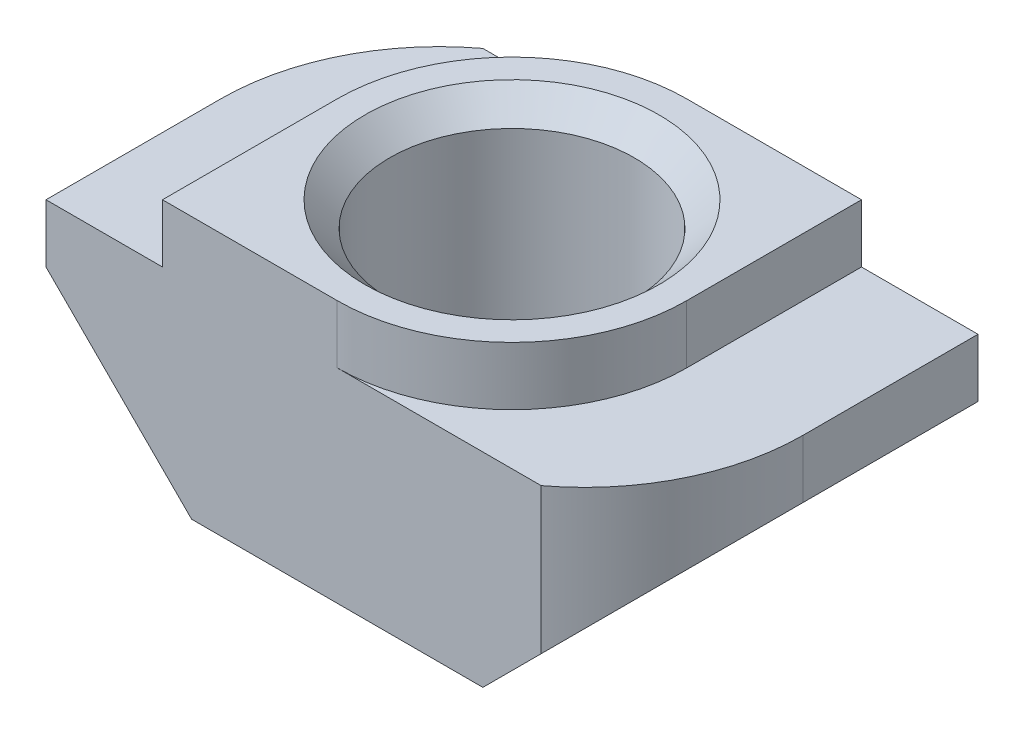
ISO-10303-21;
HEADER;
FILE_DESCRIPTION(('STEP AP214'),'2;1');
FILE_NAME('part.step','',(''),(''),'','','');
FILE_SCHEMA(('AUTOMOTIVE_DESIGN { 1 0 10303 214 1 1 1 1 }'));
ENDSEC;
DATA;
#1=APPLICATION_CONTEXT('core data for automotive mechanical design processes');
#2=APPLICATION_PROTOCOL_DEFINITION('international standard','automotive_design',2000,#1);
#3=PRODUCT_CONTEXT('',#1,'mechanical');
#4=PRODUCT('Part','Part','',(#3));
#5=PRODUCT_RELATED_PRODUCT_CATEGORY('part','',(#4));
#6=PRODUCT_DEFINITION_FORMATION('','',#4);
#7=PRODUCT_DEFINITION_CONTEXT('part definition',#1,'design');
#8=PRODUCT_DEFINITION('design','',#6,#7);
#9=PRODUCT_DEFINITION_SHAPE('','',#8);
#10=(LENGTH_UNIT() NAMED_UNIT(*) SI_UNIT(.MILLI.,.METRE.));
#11=(NAMED_UNIT(*) PLANE_ANGLE_UNIT() SI_UNIT($,.RADIAN.));
#12=(NAMED_UNIT(*) SI_UNIT($,.STERADIAN.) SOLID_ANGLE_UNIT());
#13=UNCERTAINTY_MEASURE_WITH_UNIT(LENGTH_MEASURE(1.E-05),#10,'distance_accuracy_value','');
#14=(GEOMETRIC_REPRESENTATION_CONTEXT(3) GLOBAL_UNCERTAINTY_ASSIGNED_CONTEXT((#13)) GLOBAL_UNIT_ASSIGNED_CONTEXT((#10,
#11,#12)) REPRESENTATION_CONTEXT('',''));
#15=CARTESIAN_POINT('',(0.,0.,0.));
#16=DIRECTION('',(0.,0.,1.));
#17=DIRECTION('',(1.,0.,0.));
#18=AXIS2_PLACEMENT_3D('',#15,#16,#17);
#19=CARTESIAN_POINT('',(-3.,4.5,6.));
#20=DIRECTION('',(0.,-1.,0.));
#21=DIRECTION('',(0.,0.,-1.));
#22=AXIS2_PLACEMENT_3D('',#19,#20,#21);
#23=PLANE('',#22);
#24=CARTESIAN_POINT('',(0.,4.5,3.));
#25=DIRECTION('',(0.,1.,0.));
#26=DIRECTION('',(0.,0.,1.));
#27=AXIS2_PLACEMENT_3D('',#24,#25,#26);
#28=CIRCLE('',#27,2.525);
#29=CARTESIAN_POINT('',(0.,4.5,5.525));
#30=VERTEX_POINT('',#29);
#31=EDGE_CURVE('E262',#30,#30,#28,.T.);
#32=ORIENTED_EDGE('',*,*,#31,.F.);
#33=EDGE_LOOP('',(#32));
#34=FACE_BOUND('',#33,.T.);
#35=DIRECTION('',(-1.,0.,0.));
#36=VECTOR('',#35,1.);
#37=CARTESIAN_POINT('',(-3.,4.5,6.));
#38=LINE('',#37,#36);
#39=CARTESIAN_POINT('',(0.,4.5,6.));
#40=VERTEX_POINT('',#39);
#41=CARTESIAN_POINT('',(-3.,4.5,6.));
#42=VERTEX_POINT('',#41);
#43=EDGE_CURVE('E230',#40,#42,#38,.T.);
#44=ORIENTED_EDGE('',*,*,#43,.F.);
#45=CARTESIAN_POINT('',(0.,4.5,3.));
#46=DIRECTION('',(0.,-1.,0.));
#47=DIRECTION('',(0.,0.,-1.));
#48=AXIS2_PLACEMENT_3D('',#45,#46,#47);
#49=CIRCLE('',#48,3.);
#50=CARTESIAN_POINT('',(3.,4.5,3.));
#51=VERTEX_POINT('',#50);
#52=EDGE_CURVE('E248',#51,#40,#49,.T.);
#53=ORIENTED_EDGE('',*,*,#52,.F.);
#54=DIRECTION('',(0.,0.,-1.));
#55=VECTOR('',#54,1.);
#56=CARTESIAN_POINT('',(3.,4.5,6.));
#57=LINE('',#56,#55);
#58=CARTESIAN_POINT('',(3.,4.5,0.));
#59=VERTEX_POINT('',#58);
#60=EDGE_CURVE('E173',#51,#59,#57,.T.);
#61=ORIENTED_EDGE('',*,*,#60,.T.);
#62=DIRECTION('',(-1.,0.,0.));
#63=VECTOR('',#62,1.);
#64=CARTESIAN_POINT('',(-3.,4.5,0.));
#65=LINE('',#64,#63);
#66=CARTESIAN_POINT('',(0.,4.5,0.));
#67=VERTEX_POINT('',#66);
#68=EDGE_CURVE('E208',#59,#67,#65,.T.);
#69=ORIENTED_EDGE('',*,*,#68,.T.);
#70=CARTESIAN_POINT('',(0.,4.5,3.00000000000001));
#71=DIRECTION('',(0.,-1.,0.));
#72=DIRECTION('',(0.,0.,-1.));
#73=AXIS2_PLACEMENT_3D('',#70,#71,#72);
#74=CIRCLE('',#73,3.00000000000001);
#75=CARTESIAN_POINT('',(-3.,4.5,3.));
#76=VERTEX_POINT('',#75);
#77=EDGE_CURVE('E238',#76,#67,#74,.T.);
#78=ORIENTED_EDGE('',*,*,#77,.F.);
#79=DIRECTION('',(0.,0.,-1.));
#80=VECTOR('',#79,1.);
#81=CARTESIAN_POINT('',(-3.,4.5,6.));
#82=LINE('',#81,#80);
#83=EDGE_CURVE('E177',#42,#76,#82,.T.);
#84=ORIENTED_EDGE('',*,*,#83,.F.);
#85=EDGE_LOOP('',(#44,#53,#61,#69,#78,#84));
#86=FACE_BOUND('',#85,.T.);
#87=ADVANCED_FACE('F51',(#34,#86),#23,.F.);
#88=CARTESIAN_POINT('',(5.,3.5,6.));
#89=DIRECTION('',(-1.,0.,0.));
#90=DIRECTION('',(0.,0.,1.));
#91=AXIS2_PLACEMENT_3D('',#88,#89,#90);
#92=PLANE('',#91);
#93=DIRECTION('',(0.,0.,-1.));
#94=VECTOR('',#93,1.);
#95=CARTESIAN_POINT('',(5.,3.5,6.));
#96=LINE('',#95,#94);
#97=CARTESIAN_POINT('',(5.,3.5,3.));
#98=VERTEX_POINT('',#97);
#99=CARTESIAN_POINT('',(5.,3.5,0.));
#100=VERTEX_POINT('',#99);
#101=EDGE_CURVE('E162',#98,#100,#96,.T.);
#102=ORIENTED_EDGE('',*,*,#101,.F.);
#103=DIRECTION('',(0.,1.,0.));
#104=VECTOR('',#103,1.);
#105=CARTESIAN_POINT('',(5.,0.,3.));
#106=LINE('',#105,#104);
#107=CARTESIAN_POINT('',(5.,2.5,3.));
#108=VERTEX_POINT('',#107);
#109=EDGE_CURVE('E149',#108,#98,#106,.T.);
#110=ORIENTED_EDGE('',*,*,#109,.F.);
#111=DIRECTION('',(0.,0.,-1.));
#112=VECTOR('',#111,1.);
#113=CARTESIAN_POINT('',(5.,2.5,6.));
#114=LINE('',#113,#112);
#115=CARTESIAN_POINT('',(5.,2.5,0.));
#116=VERTEX_POINT('',#115);
#117=EDGE_CURVE('E195',#108,#116,#114,.T.);
#118=ORIENTED_EDGE('',*,*,#117,.T.);
#119=DIRECTION('',(0.,1.,0.));
#120=VECTOR('',#119,1.);
#121=CARTESIAN_POINT('',(5.,3.5,0.));
#122=LINE('',#121,#120);
#123=EDGE_CURVE('E170',#116,#100,#122,.T.);
#124=ORIENTED_EDGE('',*,*,#123,.T.);
#125=EDGE_LOOP('',(#102,#110,#118,#124));
#126=FACE_BOUND('',#125,.T.);
#127=ADVANCED_FACE('F53',(#126),#92,.F.);
#128=CARTESIAN_POINT('',(3.,3.5,6.));
#129=DIRECTION('',(0.,-1.,0.));
#130=DIRECTION('',(0.,0.,-1.));
#131=AXIS2_PLACEMENT_3D('',#128,#129,#130);
#132=PLANE('',#131);
#133=DIRECTION('',(-1.,0.,0.));
#134=VECTOR('',#133,1.);
#135=CARTESIAN_POINT('',(3.,3.5,6.));
#136=LINE('',#135,#134);
#137=CARTESIAN_POINT('',(3.5,3.5,6.));
#138=VERTEX_POINT('',#137);
#139=CARTESIAN_POINT('',(0.,3.5,6.));
#140=VERTEX_POINT('',#139);
#141=EDGE_CURVE('E165',#138,#140,#136,.T.);
#142=ORIENTED_EDGE('',*,*,#141,.F.);
#143=CARTESIAN_POINT('',(1.25,3.5,3.));
#144=DIRECTION('',(0.,-1.,0.));
#145=DIRECTION('',(0.,0.,-1.));
#146=AXIS2_PLACEMENT_3D('',#143,#144,#145);
#147=CIRCLE('',#146,3.75);
#148=EDGE_CURVE('E66',#98,#138,#147,.T.);
#149=ORIENTED_EDGE('',*,*,#148,.F.);
#150=ORIENTED_EDGE('',*,*,#101,.T.);
#151=DIRECTION('',(-1.,0.,0.));
#152=VECTOR('',#151,1.);
#153=CARTESIAN_POINT('',(3.,3.5,0.));
#154=LINE('',#153,#152);
#155=CARTESIAN_POINT('',(3.,3.5,0.));
#156=VERTEX_POINT('',#155);
#157=EDGE_CURVE('E214',#100,#156,#154,.T.);
#158=ORIENTED_EDGE('',*,*,#157,.T.);
#159=DIRECTION('',(0.,0.,-1.));
#160=VECTOR('',#159,1.);
#161=CARTESIAN_POINT('',(3.,3.5,6.));
#162=LINE('',#161,#160);
#163=CARTESIAN_POINT('',(3.,3.5,3.));
#164=VERTEX_POINT('',#163);
#165=EDGE_CURVE('E171',#164,#156,#162,.T.);
#166=ORIENTED_EDGE('',*,*,#165,.F.);
#167=CARTESIAN_POINT('',(0.,3.5,3.));
#168=DIRECTION('',(0.,-1.,0.));
#169=DIRECTION('',(0.,0.,-1.));
#170=AXIS2_PLACEMENT_3D('',#167,#168,#169);
#171=CIRCLE('',#170,3.);
#172=EDGE_CURVE('E245',#164,#140,#171,.T.);
#173=ORIENTED_EDGE('',*,*,#172,.T.);
#174=EDGE_LOOP('',(#142,#149,#150,#158,#166,#173));
#175=FACE_BOUND('',#174,.T.);
#176=ADVANCED_FACE('F160',(#175),#132,.F.);
#177=CARTESIAN_POINT('',(3.,4.5,6.));
#178=DIRECTION('',(-1.,0.,0.));
#179=DIRECTION('',(0.,0.,1.));
#180=AXIS2_PLACEMENT_3D('',#177,#178,#179);
#181=PLANE('',#180);
#182=ORIENTED_EDGE('',*,*,#60,.F.);
#183=DIRECTION('',(0.,1.,0.));
#184=VECTOR('',#183,1.);
#185=CARTESIAN_POINT('',(3.,-0.742640687119286,3.));
#186=LINE('',#185,#184);
#187=EDGE_CURVE('E246',#164,#51,#186,.T.);
#188=ORIENTED_EDGE('',*,*,#187,.F.);
#189=ORIENTED_EDGE('',*,*,#165,.T.);
#190=DIRECTION('',(0.,1.,0.));
#191=VECTOR('',#190,1.);
#192=CARTESIAN_POINT('',(3.,4.5,0.));
#193=LINE('',#192,#191);
#194=EDGE_CURVE('E211',#156,#59,#193,.T.);
#195=ORIENTED_EDGE('',*,*,#194,.T.);
#196=EDGE_LOOP('',(#182,#188,#189,#195));
#197=FACE_BOUND('',#196,.T.);
#198=ADVANCED_FACE('F286',(#197),#181,.F.);
#199=CARTESIAN_POINT('',(-3.,4.5,6.));
#200=DIRECTION('',(1.,0.,0.));
#201=DIRECTION('',(0.,0.,-1.));
#202=AXIS2_PLACEMENT_3D('',#199,#200,#201);
#203=PLANE('',#202);
#204=ORIENTED_EDGE('',*,*,#83,.T.);
#205=DIRECTION('',(0.,1.,0.));
#206=VECTOR('',#205,1.);
#207=CARTESIAN_POINT('',(-3.,-0.742640687119286,3.));
#208=LINE('',#207,#206);
#209=CARTESIAN_POINT('',(-3.,3.5,3.));
#210=VERTEX_POINT('',#209);
#211=EDGE_CURVE('E236',#210,#76,#208,.T.);
#212=ORIENTED_EDGE('',*,*,#211,.F.);
#213=DIRECTION('',(0.,0.,-1.));
#214=VECTOR('',#213,1.);
#215=CARTESIAN_POINT('',(-3.,3.5,6.));
#216=LINE('',#215,#214);
#217=CARTESIAN_POINT('',(-3.,3.5,6.));
#218=VERTEX_POINT('',#217);
#219=EDGE_CURVE('E180',#218,#210,#216,.T.);
#220=ORIENTED_EDGE('',*,*,#219,.F.);
#221=DIRECTION('',(0.,-1.,0.));
#222=VECTOR('',#221,1.);
#223=CARTESIAN_POINT('',(-3.,4.5,6.));
#224=LINE('',#223,#222);
#225=EDGE_CURVE('E228',#42,#218,#224,.T.);
#226=ORIENTED_EDGE('',*,*,#225,.F.);
#227=EDGE_LOOP('',(#204,#212,#220,#226));
#228=FACE_BOUND('',#227,.T.);
#229=ADVANCED_FACE('F295',(#228),#203,.F.);
#230=CARTESIAN_POINT('',(-3.,3.5,6.));
#231=DIRECTION('',(0.,-1.,0.));
#232=DIRECTION('',(0.,0.,-1.));
#233=AXIS2_PLACEMENT_3D('',#230,#231,#232);
#234=PLANE('',#233);
#235=DIRECTION('',(-1.,0.,0.));
#236=VECTOR('',#235,1.);
#237=CARTESIAN_POINT('',(-3.,3.5,0.));
#238=LINE('',#237,#236);
#239=CARTESIAN_POINT('',(0.,3.5,0.));
#240=VERTEX_POINT('',#239);
#241=CARTESIAN_POINT('',(-3.49999999999998,3.5,0.));
#242=VERTEX_POINT('',#241);
#243=EDGE_CURVE('E205',#240,#242,#238,.T.);
#244=ORIENTED_EDGE('',*,*,#243,.T.);
#245=CARTESIAN_POINT('',(-1.25,3.5,2.99999999999999));
#246=DIRECTION('',(0.,-1.,0.));
#247=DIRECTION('',(0.,0.,-1.));
#248=AXIS2_PLACEMENT_3D('',#245,#246,#247);
#249=CIRCLE('',#248,3.75);
#250=CARTESIAN_POINT('',(-5.,3.5,2.99999999999997));
#251=VERTEX_POINT('',#250);
#252=EDGE_CURVE('E73',#251,#242,#249,.T.);
#253=ORIENTED_EDGE('',*,*,#252,.F.);
#254=DIRECTION('',(0.,0.,-1.));
#255=VECTOR('',#254,1.);
#256=CARTESIAN_POINT('',(-5.,3.5,6.));
#257=LINE('',#256,#255);
#258=CARTESIAN_POINT('',(-5.,3.5,6.));
#259=VERTEX_POINT('',#258);
#260=EDGE_CURVE('E183',#259,#251,#257,.T.);
#261=ORIENTED_EDGE('',*,*,#260,.F.);
#262=DIRECTION('',(-1.,0.,0.));
#263=VECTOR('',#262,1.);
#264=CARTESIAN_POINT('',(-3.,3.5,6.));
#265=LINE('',#264,#263);
#266=EDGE_CURVE('E226',#218,#259,#265,.T.);
#267=ORIENTED_EDGE('',*,*,#266,.F.);
#268=ORIENTED_EDGE('',*,*,#219,.T.);
#269=CARTESIAN_POINT('',(0.,3.5,3.00000000000001));
#270=DIRECTION('',(0.,-1.,0.));
#271=DIRECTION('',(0.,0.,-1.));
#272=AXIS2_PLACEMENT_3D('',#269,#270,#271);
#273=CIRCLE('',#272,3.00000000000001);
#274=EDGE_CURVE('E235',#210,#240,#273,.T.);
#275=ORIENTED_EDGE('',*,*,#274,.T.);
#276=EDGE_LOOP('',(#244,#253,#261,#267,#268,#275));
#277=FACE_BOUND('',#276,.T.);
#278=ADVANCED_FACE('F299',(#277),#234,.F.);
#279=CARTESIAN_POINT('',(-5.,3.5,6.));
#280=DIRECTION('',(1.,0.,0.));
#281=DIRECTION('',(0.,0.,-1.));
#282=AXIS2_PLACEMENT_3D('',#279,#280,#281);
#283=PLANE('',#282);
#284=ORIENTED_EDGE('',*,*,#260,.T.);
#285=DIRECTION('',(0.,1.,0.));
#286=VECTOR('',#285,1.);
#287=CARTESIAN_POINT('',(-5.,0.,2.99999999999997));
#288=LINE('',#287,#286);
#289=CARTESIAN_POINT('',(-5.,2.49999999999999,2.99999999999997));
#290=VERTEX_POINT('',#289);
#291=EDGE_CURVE('E166',#290,#251,#288,.T.);
#292=ORIENTED_EDGE('',*,*,#291,.F.);
#293=DIRECTION('',(0.,0.,-1.));
#294=VECTOR('',#293,1.);
#295=CARTESIAN_POINT('',(-5.,2.5,6.));
#296=LINE('',#295,#294);
#297=CARTESIAN_POINT('',(-5.,2.5,6.));
#298=VERTEX_POINT('',#297);
#299=EDGE_CURVE('E186',#298,#290,#296,.T.);
#300=ORIENTED_EDGE('',*,*,#299,.F.);
#301=DIRECTION('',(0.,-1.,0.));
#302=VECTOR('',#301,1.);
#303=CARTESIAN_POINT('',(-5.,3.5,6.));
#304=LINE('',#303,#302);
#305=EDGE_CURVE('E224',#259,#298,#304,.T.);
#306=ORIENTED_EDGE('',*,*,#305,.F.);
#307=EDGE_LOOP('',(#284,#292,#300,#306));
#308=FACE_BOUND('',#307,.T.);
#309=ADVANCED_FACE('F306',(#308),#283,.F.);
#310=CARTESIAN_POINT('',(-5.,2.5,6.));
#311=DIRECTION('',(0.707106781186549,0.707106781186546,0.));
#312=DIRECTION('',(-0.707106781186546,0.707106781186549,0.));
#313=AXIS2_PLACEMENT_3D('',#310,#311,#312);
#314=PLANE('',#313);
#315=ORIENTED_EDGE('',*,*,#299,.T.);
#316=CARTESIAN_POINT('',(-1.25,-1.25000000000002,2.99999999999999));
#317=DIRECTION('',(0.707106781186549,0.707106781186546,0.));
#318=DIRECTION('',(-0.707106781186546,0.707106781186549,0.));
#319=AXIS2_PLACEMENT_3D('',#316,#317,#318);
#320=ELLIPSE('',#319,5.30330085889912,3.75);
#321=CARTESIAN_POINT('',(-3.49999999999998,1.,0.));
#322=VERTEX_POINT('',#321);
#323=EDGE_CURVE('E156',#290,#322,#320,.F.);
#324=ORIENTED_EDGE('',*,*,#323,.T.);
#325=DIRECTION('',(0.707106781186546,-0.707106781186549,0.));
#326=VECTOR('',#325,1.);
#327=CARTESIAN_POINT('',(-5.,2.5,0.));
#328=LINE('',#327,#326);
#329=CARTESIAN_POINT('',(-2.50000000000001,0.,0.));
#330=VERTEX_POINT('',#329);
#331=EDGE_CURVE('E203',#322,#330,#328,.T.);
#332=ORIENTED_EDGE('',*,*,#331,.T.);
#333=DIRECTION('',(0.,0.,-1.));
#334=VECTOR('',#333,1.);
#335=CARTESIAN_POINT('',(-2.50000000000001,0.,6.));
#336=LINE('',#335,#334);
#337=CARTESIAN_POINT('',(-2.50000000000001,0.,6.));
#338=VERTEX_POINT('',#337);
#339=EDGE_CURVE('E189',#338,#330,#336,.T.);
#340=ORIENTED_EDGE('',*,*,#339,.F.);
#341=DIRECTION('',(0.707106781186546,-0.707106781186549,0.));
#342=VECTOR('',#341,1.);
#343=CARTESIAN_POINT('',(-5.,2.5,6.));
#344=LINE('',#343,#342);
#345=EDGE_CURVE('E222',#298,#338,#344,.T.);
#346=ORIENTED_EDGE('',*,*,#345,.F.);
#347=EDGE_LOOP('',(#315,#324,#332,#340,#346));
#348=FACE_BOUND('',#347,.T.);
#349=ADVANCED_FACE('F308',(#348),#314,.F.);
#350=CARTESIAN_POINT('',(2.50000000000001,0.,6.));
#351=DIRECTION('',(0.,1.,0.));
#352=DIRECTION('',(0.,0.,1.));
#353=AXIS2_PLACEMENT_3D('',#350,#351,#352);
#354=PLANE('',#353);
#355=CARTESIAN_POINT('',(0.,0.,3.));
#356=DIRECTION('',(0.,1.,0.));
#357=DIRECTION('',(0.,0.,1.));
#358=AXIS2_PLACEMENT_3D('',#355,#356,#357);
#359=CIRCLE('',#358,2.1);
#360=CARTESIAN_POINT('',(0.,0.,5.1));
#361=VERTEX_POINT('',#360);
#362=EDGE_CURVE('E255',#361,#361,#359,.T.);
#363=ORIENTED_EDGE('',*,*,#362,.T.);
#364=EDGE_LOOP('',(#363));
#365=FACE_BOUND('',#364,.T.);
#366=DIRECTION('',(1.,0.,0.));
#367=VECTOR('',#366,1.);
#368=CARTESIAN_POINT('',(2.50000000000001,0.,0.));
#369=LINE('',#368,#367);
#370=CARTESIAN_POINT('',(2.50000000000001,0.,0.));
#371=VERTEX_POINT('',#370);
#372=EDGE_CURVE('E201',#330,#371,#369,.T.);
#373=ORIENTED_EDGE('',*,*,#372,.T.);
#374=DIRECTION('',(0.,0.,-1.));
#375=VECTOR('',#374,1.);
#376=CARTESIAN_POINT('',(2.50000000000001,0.,6.));
#377=LINE('',#376,#375);
#378=CARTESIAN_POINT('',(2.50000000000001,0.,6.));
#379=VERTEX_POINT('',#378);
#380=EDGE_CURVE('E192',#379,#371,#377,.T.);
#381=ORIENTED_EDGE('',*,*,#380,.F.);
#382=DIRECTION('',(1.,0.,0.));
#383=VECTOR('',#382,1.);
#384=CARTESIAN_POINT('',(2.50000000000001,0.,6.));
#385=LINE('',#384,#383);
#386=EDGE_CURVE('E220',#338,#379,#385,.T.);
#387=ORIENTED_EDGE('',*,*,#386,.F.);
#388=ORIENTED_EDGE('',*,*,#339,.T.);
#389=EDGE_LOOP('',(#373,#381,#387,#388));
#390=FACE_BOUND('',#389,.T.);
#391=ADVANCED_FACE('F314',(#365,#390),#354,.F.);
#392=CARTESIAN_POINT('',(5.,2.5,6.));
#393=DIRECTION('',(-0.707106781186549,0.707106781186546,0.));
#394=DIRECTION('',(-0.707106781186546,-0.707106781186549,0.));
#395=AXIS2_PLACEMENT_3D('',#392,#393,#394);
#396=PLANE('',#395);
#397=ORIENTED_EDGE('',*,*,#117,.F.);
#398=CARTESIAN_POINT('',(1.25,-1.25000000000002,3.));
#399=DIRECTION('',(-0.707106781186549,0.707106781186546,0.));
#400=DIRECTION('',(0.707106781186546,0.707106781186549,0.));
#401=AXIS2_PLACEMENT_3D('',#398,#399,#400);
#402=ELLIPSE('',#401,5.30330085889912,3.75);
#403=CARTESIAN_POINT('',(3.5,0.999999999999991,6.));
#404=VERTEX_POINT('',#403);
#405=EDGE_CURVE('E152',#108,#404,#402,.F.);
#406=ORIENTED_EDGE('',*,*,#405,.T.);
#407=DIRECTION('',(0.707106781186546,0.707106781186549,0.));
#408=VECTOR('',#407,1.);
#409=CARTESIAN_POINT('',(5.,2.5,6.));
#410=LINE('',#409,#408);
#411=EDGE_CURVE('E197',#379,#404,#410,.T.);
#412=ORIENTED_EDGE('',*,*,#411,.F.);
#413=ORIENTED_EDGE('',*,*,#380,.T.);
#414=DIRECTION('',(0.707106781186546,0.707106781186549,0.));
#415=VECTOR('',#414,1.);
#416=CARTESIAN_POINT('',(5.,2.5,0.));
#417=LINE('',#416,#415);
#418=EDGE_CURVE('E198',#371,#116,#417,.T.);
#419=ORIENTED_EDGE('',*,*,#418,.T.);
#420=EDGE_LOOP('',(#397,#406,#412,#413,#419));
#421=FACE_BOUND('',#420,.T.);
#422=ADVANCED_FACE('F317',(#421),#396,.F.);
#423=CARTESIAN_POINT('',(0.,0.,6.));
#424=DIRECTION('',(0.,0.,-1.));
#425=DIRECTION('',(-1.,0.,0.));
#426=AXIS2_PLACEMENT_3D('',#423,#424,#425);
#427=PLANE('',#426);
#428=ORIENTED_EDGE('',*,*,#411,.T.);
#429=DIRECTION('',(0.,1.,0.));
#430=VECTOR('',#429,1.);
#431=CARTESIAN_POINT('',(3.5,0.,6.));
#432=LINE('',#431,#430);
#433=EDGE_CURVE('E11',#404,#138,#432,.T.);
#434=ORIENTED_EDGE('',*,*,#433,.T.);
#435=ORIENTED_EDGE('',*,*,#141,.T.);
#436=DIRECTION('',(0.,1.,0.));
#437=VECTOR('',#436,1.);
#438=CARTESIAN_POINT('',(0.,-0.742640687119286,6.));
#439=LINE('',#438,#437);
#440=EDGE_CURVE('E242',#140,#40,#439,.T.);
#441=ORIENTED_EDGE('',*,*,#440,.T.);
#442=ORIENTED_EDGE('',*,*,#43,.T.);
#443=ORIENTED_EDGE('',*,*,#225,.T.);
#444=ORIENTED_EDGE('',*,*,#266,.T.);
#445=ORIENTED_EDGE('',*,*,#305,.T.);
#446=ORIENTED_EDGE('',*,*,#345,.T.);
#447=ORIENTED_EDGE('',*,*,#386,.T.);
#448=EDGE_LOOP('',(#428,#434,#435,#441,#442,#443,#444,#445,#446,#447));
#449=FACE_BOUND('',#448,.T.);
#450=ADVANCED_FACE('F278',(#449),#427,.F.);
#451=CARTESIAN_POINT('',(0.,0.,0.));
#452=DIRECTION('',(0.,0.,-1.));
#453=DIRECTION('',(-1.,0.,0.));
#454=AXIS2_PLACEMENT_3D('',#451,#452,#453);
#455=PLANE('',#454);
#456=DIRECTION('',(0.,1.,0.));
#457=VECTOR('',#456,1.);
#458=CARTESIAN_POINT('',(-3.50000000000001,0.,0.));
#459=LINE('',#458,#457);
#460=EDGE_CURVE('E59',#242,#322,#459,.F.);
#461=ORIENTED_EDGE('',*,*,#460,.F.);
#462=ORIENTED_EDGE('',*,*,#243,.F.);
#463=DIRECTION('',(0.,1.,0.));
#464=VECTOR('',#463,1.);
#465=CARTESIAN_POINT('',(0.,-0.742640687119286,0.));
#466=LINE('',#465,#464);
#467=EDGE_CURVE('E217',#240,#67,#466,.T.);
#468=ORIENTED_EDGE('',*,*,#467,.T.);
#469=ORIENTED_EDGE('',*,*,#68,.F.);
#470=ORIENTED_EDGE('',*,*,#194,.F.);
#471=ORIENTED_EDGE('',*,*,#157,.F.);
#472=ORIENTED_EDGE('',*,*,#123,.F.);
#473=ORIENTED_EDGE('',*,*,#418,.F.);
#474=ORIENTED_EDGE('',*,*,#372,.F.);
#475=ORIENTED_EDGE('',*,*,#331,.F.);
#476=EDGE_LOOP('',(#461,#462,#468,#469,#470,#471,#472,#473,#474,#475));
#477=FACE_BOUND('',#476,.T.);
#478=ADVANCED_FACE('F290',(#477),#455,.T.);
#479=CARTESIAN_POINT('',(0.,-0.742640687119286,3.00000000000001));
#480=DIRECTION('',(0.,1.,0.));
#481=DIRECTION('',(0.,0.,1.));
#482=AXIS2_PLACEMENT_3D('',#479,#480,#481);
#483=CYLINDRICAL_SURFACE('',#482,3.00000000000001);
#484=ORIENTED_EDGE('',*,*,#211,.T.);
#485=ORIENTED_EDGE('',*,*,#77,.T.);
#486=ORIENTED_EDGE('',*,*,#467,.F.);
#487=ORIENTED_EDGE('',*,*,#274,.F.);
#488=EDGE_LOOP('',(#484,#485,#486,#487));
#489=FACE_BOUND('',#488,.T.);
#490=ADVANCED_FACE('F319',(#489),#483,.T.);
#491=CARTESIAN_POINT('',(0.,-0.742640687119286,3.));
#492=DIRECTION('',(0.,1.,0.));
#493=DIRECTION('',(0.,0.,1.));
#494=AXIS2_PLACEMENT_3D('',#491,#492,#493);
#495=CYLINDRICAL_SURFACE('',#494,3.);
#496=ORIENTED_EDGE('',*,*,#187,.T.);
#497=ORIENTED_EDGE('',*,*,#52,.T.);
#498=ORIENTED_EDGE('',*,*,#440,.F.);
#499=ORIENTED_EDGE('',*,*,#172,.F.);
#500=EDGE_LOOP('',(#496,#497,#498,#499));
#501=FACE_BOUND('',#500,.T.);
#502=ADVANCED_FACE('F282',(#501),#495,.T.);
#503=CARTESIAN_POINT('',(-1.25,0.,2.99999999999999));
#504=DIRECTION('',(0.,1.,0.));
#505=DIRECTION('',(0.,0.,1.));
#506=AXIS2_PLACEMENT_3D('',#503,#504,#505);
#507=CYLINDRICAL_SURFACE('',#506,3.75);
#508=ORIENTED_EDGE('',*,*,#291,.T.);
#509=ORIENTED_EDGE('',*,*,#252,.T.);
#510=ORIENTED_EDGE('',*,*,#460,.T.);
#511=ORIENTED_EDGE('',*,*,#323,.F.);
#512=EDGE_LOOP('',(#508,#509,#510,#511));
#513=FACE_BOUND('',#512,.T.);
#514=ADVANCED_FACE('F326',(#513),#507,.T.);
#515=CARTESIAN_POINT('',(1.25,0.,3.));
#516=DIRECTION('',(0.,1.,0.));
#517=DIRECTION('',(0.,0.,1.));
#518=AXIS2_PLACEMENT_3D('',#515,#516,#517);
#519=CYLINDRICAL_SURFACE('',#518,3.75);
#520=ORIENTED_EDGE('',*,*,#109,.T.);
#521=ORIENTED_EDGE('',*,*,#148,.T.);
#522=ORIENTED_EDGE('',*,*,#433,.F.);
#523=ORIENTED_EDGE('',*,*,#405,.F.);
#524=EDGE_LOOP('',(#520,#521,#522,#523));
#525=FACE_BOUND('',#524,.T.);
#526=ADVANCED_FACE('F150',(#525),#519,.T.);
#527=CARTESIAN_POINT('',(0.,4.5,3.));
#528=DIRECTION('',(0.,1.,0.));
#529=DIRECTION('',(0.,0.,1.));
#530=AXIS2_PLACEMENT_3D('',#527,#528,#529);
#531=CYLINDRICAL_SURFACE('',#530,2.1);
#532=ORIENTED_EDGE('',*,*,#362,.F.);
#533=EDGE_LOOP('',(#532));
#534=FACE_BOUND('',#533,.T.);
#535=CARTESIAN_POINT('',(0.,4.075,3.));
#536=DIRECTION('',(0.,1.,0.));
#537=DIRECTION('',(0.,0.,1.));
#538=AXIS2_PLACEMENT_3D('',#535,#536,#537);
#539=CIRCLE('',#538,2.1);
#540=CARTESIAN_POINT('',(0.,4.075,5.1));
#541=VERTEX_POINT('',#540);
#542=EDGE_CURVE('E259',#541,#541,#539,.T.);
#543=ORIENTED_EDGE('',*,*,#542,.T.);
#544=EDGE_LOOP('',(#543));
#545=FACE_BOUND('',#544,.T.);
#546=ADVANCED_FACE('F373',(#534,#545),#531,.F.);
#547=CARTESIAN_POINT('',(0.,4.5,3.));
#548=DIRECTION('',(0.,1.,0.));
#549=DIRECTION('',(0.,0.,1.));
#550=AXIS2_PLACEMENT_3D('',#547,#548,#549);
#551=CONICAL_SURFACE('',#550,2.525,0.785398163397449);
#552=ORIENTED_EDGE('',*,*,#542,.F.);
#553=EDGE_LOOP('',(#552));
#554=FACE_BOUND('',#553,.T.);
#555=ORIENTED_EDGE('',*,*,#31,.T.);
#556=EDGE_LOOP('',(#555));
#557=FACE_BOUND('',#556,.T.);
#558=ADVANCED_FACE('F266',(#554,#557),#551,.F.);
#559=CLOSED_SHELL('',(#87,#127,#176,#198,#229,#278,#309,#349,#391,#422,#450,#478,#490,#502,#514,
#526,#546,#558));
#560=MANIFOLD_SOLID_BREP('B2',#559);
#561=ADVANCED_BREP_SHAPE_REPRESENTATION('',(#18,#560),#14);
#562=SHAPE_DEFINITION_REPRESENTATION(#9,#561);
ENDSEC;
END-ISO-10303-21;
